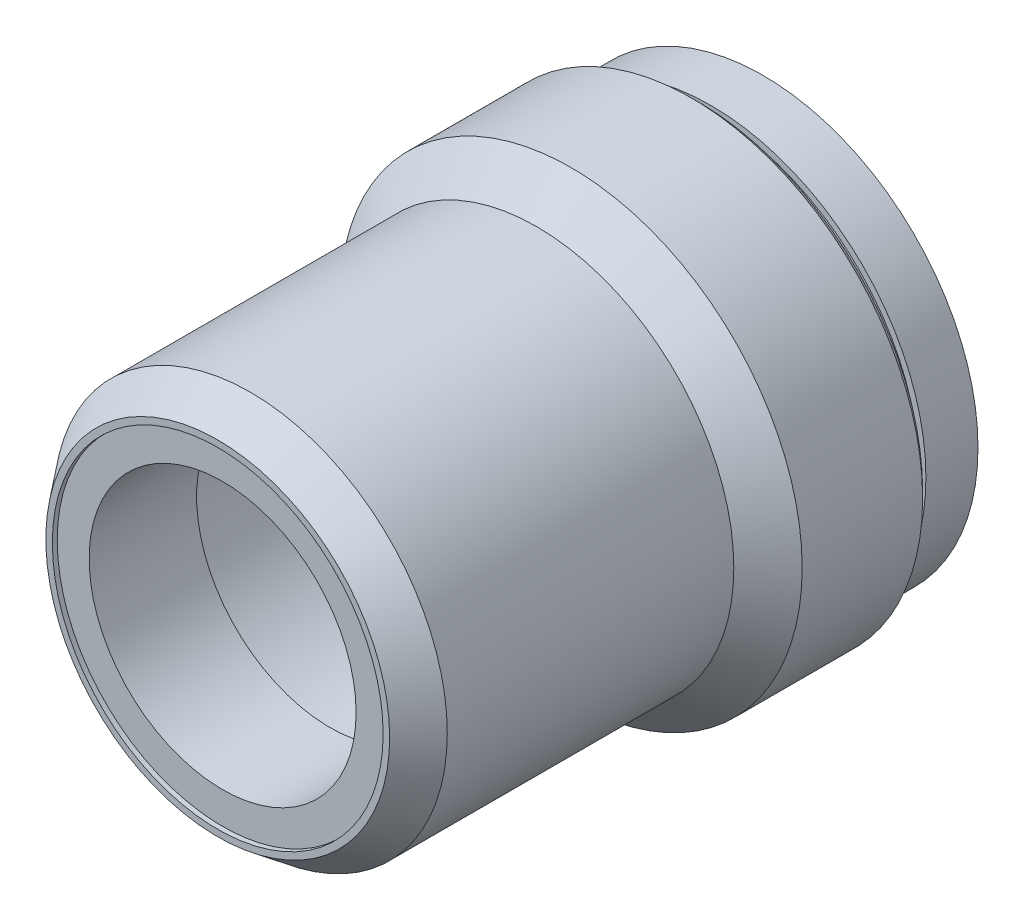
ISO-10303-21;
HEADER;
FILE_DESCRIPTION(('STEP AP214'),'2;1');
FILE_NAME('part.step','',(''),(''),'','','');
FILE_SCHEMA(('AUTOMOTIVE_DESIGN { 1 0 10303 214 1 1 1 1 }'));
ENDSEC;
DATA;
#1=APPLICATION_CONTEXT('core data for automotive mechanical design processes');
#2=APPLICATION_PROTOCOL_DEFINITION('international standard','automotive_design',2000,#1);
#3=PRODUCT_CONTEXT('',#1,'mechanical');
#4=PRODUCT('Part','Part','',(#3));
#5=PRODUCT_RELATED_PRODUCT_CATEGORY('part','',(#4));
#6=PRODUCT_DEFINITION_FORMATION('','',#4);
#7=PRODUCT_DEFINITION_CONTEXT('part definition',#1,'design');
#8=PRODUCT_DEFINITION('design','',#6,#7);
#9=PRODUCT_DEFINITION_SHAPE('','',#8);
#10=(LENGTH_UNIT() NAMED_UNIT(*) SI_UNIT(.MILLI.,.METRE.));
#11=(NAMED_UNIT(*) PLANE_ANGLE_UNIT() SI_UNIT($,.RADIAN.));
#12=(NAMED_UNIT(*) SI_UNIT($,.STERADIAN.) SOLID_ANGLE_UNIT());
#13=UNCERTAINTY_MEASURE_WITH_UNIT(LENGTH_MEASURE(1.E-05),#10,'distance_accuracy_value','');
#14=(GEOMETRIC_REPRESENTATION_CONTEXT(3) GLOBAL_UNCERTAINTY_ASSIGNED_CONTEXT((#13)) GLOBAL_UNIT_ASSIGNED_CONTEXT((#10,
#11,#12)) REPRESENTATION_CONTEXT('',''));
#15=CARTESIAN_POINT('',(0.,0.,0.));
#16=DIRECTION('',(0.,0.,1.));
#17=DIRECTION('',(1.,0.,0.));
#18=AXIS2_PLACEMENT_3D('',#15,#16,#17);
#19=CARTESIAN_POINT('',(0.,0.,35.9278884160858));
#20=DIRECTION('',(0.,0.,1.));
#21=DIRECTION('',(1.,0.,0.));
#22=AXIS2_PLACEMENT_3D('',#19,#20,#21);
#23=CYLINDRICAL_SURFACE('',#22,33.);
#24=CARTESIAN_POINT('',(0.,0.,-75.75));
#25=DIRECTION('',(0.,0.,-1.));
#26=DIRECTION('',(0.,-1.,0.));
#27=AXIS2_PLACEMENT_3D('',#24,#25,#26);
#28=CIRCLE('',#27,33.);
#29=CARTESIAN_POINT('',(0.,-33.,-75.75));
#30=VERTEX_POINT('',#29);
#31=EDGE_CURVE('E10',#30,#30,#28,.T.);
#32=ORIENTED_EDGE('',*,*,#31,.T.);
#33=EDGE_LOOP('',(#32));
#34=FACE_BOUND('',#33,.T.);
#35=CARTESIAN_POINT('',(0.,0.,-83.75));
#36=DIRECTION('',(0.,0.,1.));
#37=DIRECTION('',(1.,0.,0.));
#38=AXIS2_PLACEMENT_3D('',#35,#36,#37);
#39=CIRCLE('',#38,33.);
#40=CARTESIAN_POINT('',(33.,0.,-83.75));
#41=VERTEX_POINT('',#40);
#42=EDGE_CURVE('E22',#41,#41,#39,.T.);
#43=ORIENTED_EDGE('',*,*,#42,.T.);
#44=EDGE_LOOP('',(#43));
#45=FACE_BOUND('',#44,.T.);
#46=ADVANCED_FACE('F14',(#34,#45),#23,.T.);
#47=CARTESIAN_POINT('',(0.,0.,-73.75));
#48=DIRECTION('',(0.,0.,1.));
#49=DIRECTION('',(1.,0.,0.));
#50=AXIS2_PLACEMENT_3D('',#47,#48,#49);
#51=PLANE('',#50);
#52=CARTESIAN_POINT('',(0.,0.,-73.75));
#53=DIRECTION('',(0.,0.,-1.));
#54=DIRECTION('',(1.,0.,0.));
#55=AXIS2_PLACEMENT_3D('',#52,#53,#54);
#56=CIRCLE('',#55,34.5);
#57=CARTESIAN_POINT('',(34.5,0.,-73.75));
#58=VERTEX_POINT('',#57);
#59=EDGE_CURVE('E27',#58,#58,#56,.T.);
#60=ORIENTED_EDGE('',*,*,#59,.T.);
#61=EDGE_LOOP('',(#60));
#62=FACE_BOUND('',#61,.T.);
#63=CARTESIAN_POINT('',(0.,0.,-73.75));
#64=DIRECTION('',(0.,0.,-1.));
#65=DIRECTION('',(0.,-1.,0.));
#66=AXIS2_PLACEMENT_3D('',#63,#64,#65);
#67=CIRCLE('',#66,32.);
#68=CARTESIAN_POINT('',(0.,-32.,-73.75));
#69=VERTEX_POINT('',#68);
#70=EDGE_CURVE('E33',#69,#69,#67,.T.);
#71=ORIENTED_EDGE('',*,*,#70,.F.);
#72=EDGE_LOOP('',(#71));
#73=FACE_BOUND('',#72,.T.);
#74=ADVANCED_FACE('F85',(#62,#73),#51,.F.);
#75=CARTESIAN_POINT('',(0.,0.,35.9278884160858));
#76=DIRECTION('',(0.,0.,1.));
#77=DIRECTION('',(1.,0.,0.));
#78=AXIS2_PLACEMENT_3D('',#75,#76,#77);
#79=CYLINDRICAL_SURFACE('',#78,35.5);
#80=CARTESIAN_POINT('',(0.,0.,-72.75));
#81=DIRECTION('',(0.,0.,1.));
#82=DIRECTION('',(1.,0.,0.));
#83=AXIS2_PLACEMENT_3D('',#80,#81,#82);
#84=CIRCLE('',#83,35.5);
#85=CARTESIAN_POINT('',(35.5,0.,-72.75));
#86=VERTEX_POINT('',#85);
#87=EDGE_CURVE('E32',#86,#86,#84,.T.);
#88=ORIENTED_EDGE('',*,*,#87,.T.);
#89=EDGE_LOOP('',(#88));
#90=FACE_BOUND('',#89,.T.);
#91=CARTESIAN_POINT('',(0.,0.,-54.25));
#92=DIRECTION('',(0.,0.,1.));
#93=DIRECTION('',(1.,0.,0.));
#94=AXIS2_PLACEMENT_3D('',#91,#92,#93);
#95=CIRCLE('',#94,35.5);
#96=CARTESIAN_POINT('',(35.5,0.,-54.25));
#97=VERTEX_POINT('',#96);
#98=EDGE_CURVE('E38',#97,#97,#95,.T.);
#99=ORIENTED_EDGE('',*,*,#98,.F.);
#100=EDGE_LOOP('',(#99));
#101=FACE_BOUND('',#100,.T.);
#102=ADVANCED_FACE('F87',(#90,#101),#79,.T.);
#103=CARTESIAN_POINT('',(0.,0.,-49.));
#104=DIRECTION('',(0.,0.,-1.));
#105=DIRECTION('',(0.,-1.,0.));
#106=AXIS2_PLACEMENT_3D('',#103,#104,#105);
#107=CONICAL_SURFACE('',#106,30.25,0.785398163397454);
#108=ORIENTED_EDGE('',*,*,#98,.T.);
#109=EDGE_LOOP('',(#108));
#110=FACE_BOUND('',#109,.T.);
#111=CARTESIAN_POINT('',(0.,0.,-49.));
#112=DIRECTION('',(0.,0.,1.));
#113=DIRECTION('',(1.,0.,0.));
#114=AXIS2_PLACEMENT_3D('',#111,#112,#113);
#115=CIRCLE('',#114,30.25);
#116=CARTESIAN_POINT('',(30.25,0.,-49.));
#117=VERTEX_POINT('',#116);
#118=EDGE_CURVE('E41',#117,#117,#115,.T.);
#119=ORIENTED_EDGE('',*,*,#118,.F.);
#120=EDGE_LOOP('',(#119));
#121=FACE_BOUND('',#120,.T.);
#122=ADVANCED_FACE('F95',(#110,#121),#107,.T.);
#123=CARTESIAN_POINT('',(0.,0.,35.9278884160858));
#124=DIRECTION('',(0.,0.,1.));
#125=DIRECTION('',(1.,0.,0.));
#126=AXIS2_PLACEMENT_3D('',#123,#124,#125);
#127=CYLINDRICAL_SURFACE('',#126,30.25);
#128=ORIENTED_EDGE('',*,*,#118,.T.);
#129=EDGE_LOOP('',(#128));
#130=FACE_BOUND('',#129,.T.);
#131=CARTESIAN_POINT('',(0.,0.,-4.99999999999999));
#132=DIRECTION('',(0.,0.,1.));
#133=DIRECTION('',(1.,0.,0.));
#134=AXIS2_PLACEMENT_3D('',#131,#132,#133);
#135=CIRCLE('',#134,30.25);
#136=CARTESIAN_POINT('',(30.25,0.,-4.99999999999999));
#137=VERTEX_POINT('',#136);
#138=EDGE_CURVE('E44',#137,#137,#135,.T.);
#139=ORIENTED_EDGE('',*,*,#138,.F.);
#140=EDGE_LOOP('',(#139));
#141=FACE_BOUND('',#140,.T.);
#142=ADVANCED_FACE('F124',(#130,#141),#127,.T.);
#143=CARTESIAN_POINT('',(0.,0.,0.));
#144=DIRECTION('',(0.,0.,-1.));
#145=DIRECTION('',(0.,-1.,0.));
#146=AXIS2_PLACEMENT_3D('',#143,#144,#145);
#147=CONICAL_SURFACE('',#146,26.4,0.656178717991392);
#148=ORIENTED_EDGE('',*,*,#138,.T.);
#149=EDGE_LOOP('',(#148));
#150=FACE_BOUND('',#149,.T.);
#151=CARTESIAN_POINT('',(0.,0.,0.));
#152=DIRECTION('',(0.,0.,1.));
#153=DIRECTION('',(1.,0.,0.));
#154=AXIS2_PLACEMENT_3D('',#151,#152,#153);
#155=CIRCLE('',#154,26.4);
#156=CARTESIAN_POINT('',(26.4,0.,0.));
#157=VERTEX_POINT('',#156);
#158=EDGE_CURVE('E47',#157,#157,#155,.T.);
#159=ORIENTED_EDGE('',*,*,#158,.F.);
#160=EDGE_LOOP('',(#159));
#161=FACE_BOUND('',#160,.T.);
#162=ADVANCED_FACE('F104',(#150,#161),#147,.T.);
#163=CARTESIAN_POINT('',(0.,0.,0.));
#164=DIRECTION('',(0.,0.,1.));
#165=DIRECTION('',(1.,0.,0.));
#166=AXIS2_PLACEMENT_3D('',#163,#164,#165);
#167=PLANE('',#166);
#168=ORIENTED_EDGE('',*,*,#158,.T.);
#169=EDGE_LOOP('',(#168));
#170=FACE_BOUND('',#169,.T.);
#171=CARTESIAN_POINT('',(0.,0.,0.));
#172=DIRECTION('',(0.,0.,1.));
#173=DIRECTION('',(1.,0.,0.));
#174=AXIS2_PLACEMENT_3D('',#171,#172,#173);
#175=CIRCLE('',#174,25.4);
#176=CARTESIAN_POINT('',(25.4,0.,0.));
#177=VERTEX_POINT('',#176);
#178=EDGE_CURVE('E50',#177,#177,#175,.T.);
#179=ORIENTED_EDGE('',*,*,#178,.F.);
#180=EDGE_LOOP('',(#179));
#181=FACE_BOUND('',#180,.T.);
#182=ADVANCED_FACE('F100',(#170,#181),#167,.T.);
#183=CARTESIAN_POINT('',(0.,0.,35.9278884160858));
#184=DIRECTION('',(0.,0.,1.));
#185=DIRECTION('',(1.,0.,0.));
#186=AXIS2_PLACEMENT_3D('',#183,#184,#185);
#187=CYLINDRICAL_SURFACE('',#186,25.4);
#188=CARTESIAN_POINT('',(0.,0.,-0.749999999999994));
#189=DIRECTION('',(0.,0.,1.));
#190=DIRECTION('',(1.,0.,0.));
#191=AXIS2_PLACEMENT_3D('',#188,#189,#190);
#192=CIRCLE('',#191,25.4);
#193=CARTESIAN_POINT('',(25.4,0.,-0.749999999999994));
#194=VERTEX_POINT('',#193);
#195=EDGE_CURVE('E53',#194,#194,#192,.T.);
#196=ORIENTED_EDGE('',*,*,#195,.F.);
#197=EDGE_LOOP('',(#196));
#198=FACE_BOUND('',#197,.T.);
#199=ORIENTED_EDGE('',*,*,#178,.T.);
#200=EDGE_LOOP('',(#199));
#201=FACE_BOUND('',#200,.T.);
#202=ADVANCED_FACE('F103',(#198,#201),#187,.F.);
#203=CARTESIAN_POINT('',(0.,0.,-0.749999999999997));
#204=DIRECTION('',(0.,0.,-1.));
#205=DIRECTION('',(-1.,0.,0.));
#206=AXIS2_PLACEMENT_3D('',#203,#204,#205);
#207=PLANE('',#206);
#208=ORIENTED_EDGE('',*,*,#195,.T.);
#209=EDGE_LOOP('',(#208));
#210=FACE_BOUND('',#209,.T.);
#211=CARTESIAN_POINT('',(0.,0.,-0.749999999999994));
#212=DIRECTION('',(0.,0.,1.));
#213=DIRECTION('',(1.,0.,0.));
#214=AXIS2_PLACEMENT_3D('',#211,#212,#213);
#215=CIRCLE('',#214,20.5);
#216=CARTESIAN_POINT('',(20.5,0.,-0.749999999999994));
#217=VERTEX_POINT('',#216);
#218=EDGE_CURVE('E56',#217,#217,#215,.T.);
#219=ORIENTED_EDGE('',*,*,#218,.F.);
#220=EDGE_LOOP('',(#219));
#221=FACE_BOUND('',#220,.T.);
#222=ADVANCED_FACE('F106',(#210,#221),#207,.F.);
#223=CARTESIAN_POINT('',(0.,0.,35.9278884160858));
#224=DIRECTION('',(0.,0.,1.));
#225=DIRECTION('',(1.,0.,0.));
#226=AXIS2_PLACEMENT_3D('',#223,#224,#225);
#227=CYLINDRICAL_SURFACE('',#226,20.5);
#228=CARTESIAN_POINT('',(0.,0.,-17.25));
#229=DIRECTION('',(0.,0.,1.));
#230=DIRECTION('',(1.,0.,0.));
#231=AXIS2_PLACEMENT_3D('',#228,#229,#230);
#232=CIRCLE('',#231,20.5);
#233=CARTESIAN_POINT('',(20.5,0.,-17.25));
#234=VERTEX_POINT('',#233);
#235=EDGE_CURVE('E59',#234,#234,#232,.T.);
#236=ORIENTED_EDGE('',*,*,#235,.F.);
#237=EDGE_LOOP('',(#236));
#238=FACE_BOUND('',#237,.T.);
#239=ORIENTED_EDGE('',*,*,#218,.T.);
#240=EDGE_LOOP('',(#239));
#241=FACE_BOUND('',#240,.T.);
#242=ADVANCED_FACE('F109',(#238,#241),#227,.F.);
#243=CARTESIAN_POINT('',(0.,0.,-17.25));
#244=DIRECTION('',(0.,0.,1.));
#245=DIRECTION('',(1.,0.,0.));
#246=AXIS2_PLACEMENT_3D('',#243,#244,#245);
#247=PLANE('',#246);
#248=CARTESIAN_POINT('',(0.,0.,-17.25));
#249=DIRECTION('',(0.,0.,1.));
#250=DIRECTION('',(1.,0.,0.));
#251=AXIS2_PLACEMENT_3D('',#248,#249,#250);
#252=CIRCLE('',#251,25.5);
#253=CARTESIAN_POINT('',(25.5,0.,-17.25));
#254=VERTEX_POINT('',#253);
#255=EDGE_CURVE('E62',#254,#254,#252,.T.);
#256=ORIENTED_EDGE('',*,*,#255,.F.);
#257=EDGE_LOOP('',(#256));
#258=FACE_BOUND('',#257,.T.);
#259=ORIENTED_EDGE('',*,*,#235,.T.);
#260=EDGE_LOOP('',(#259));
#261=FACE_BOUND('',#260,.T.);
#262=ADVANCED_FACE('F111',(#258,#261),#247,.F.);
#263=CARTESIAN_POINT('',(0.,0.,35.9278884160858));
#264=DIRECTION('',(0.,0.,1.));
#265=DIRECTION('',(1.,0.,0.));
#266=AXIS2_PLACEMENT_3D('',#263,#264,#265);
#267=CYLINDRICAL_SURFACE('',#266,25.5);
#268=CARTESIAN_POINT('',(0.,0.,-51.3210678118655));
#269=DIRECTION('',(0.,0.,1.));
#270=DIRECTION('',(1.,0.,0.));
#271=AXIS2_PLACEMENT_3D('',#268,#269,#270);
#272=CIRCLE('',#271,25.5);
#273=CARTESIAN_POINT('',(25.5,0.,-51.3210678118655));
#274=VERTEX_POINT('',#273);
#275=EDGE_CURVE('E65',#274,#274,#272,.T.);
#276=ORIENTED_EDGE('',*,*,#275,.F.);
#277=EDGE_LOOP('',(#276));
#278=FACE_BOUND('',#277,.T.);
#279=ORIENTED_EDGE('',*,*,#255,.T.);
#280=EDGE_LOOP('',(#279));
#281=FACE_BOUND('',#280,.T.);
#282=ADVANCED_FACE('F114',(#278,#281),#267,.F.);
#283=CARTESIAN_POINT('',(0.,0.,-51.3210678118655));
#284=DIRECTION('',(0.,0.,-1.));
#285=DIRECTION('',(0.,-1.,0.));
#286=AXIS2_PLACEMENT_3D('',#283,#284,#285);
#287=CONICAL_SURFACE('',#286,25.5,0.785398163397454);
#288=CARTESIAN_POINT('',(0.,0.,-56.3210678118655));
#289=DIRECTION('',(0.,0.,1.));
#290=DIRECTION('',(1.,0.,0.));
#291=AXIS2_PLACEMENT_3D('',#288,#289,#290);
#292=CIRCLE('',#291,30.5);
#293=CARTESIAN_POINT('',(30.5,0.,-56.3210678118655));
#294=VERTEX_POINT('',#293);
#295=EDGE_CURVE('E68',#294,#294,#292,.T.);
#296=ORIENTED_EDGE('',*,*,#295,.F.);
#297=EDGE_LOOP('',(#296));
#298=FACE_BOUND('',#297,.T.);
#299=ORIENTED_EDGE('',*,*,#275,.T.);
#300=EDGE_LOOP('',(#299));
#301=FACE_BOUND('',#300,.T.);
#302=ADVANCED_FACE('F139',(#298,#301),#287,.F.);
#303=CARTESIAN_POINT('',(0.,0.,35.9278884160858));
#304=DIRECTION('',(0.,0.,1.));
#305=DIRECTION('',(1.,0.,0.));
#306=AXIS2_PLACEMENT_3D('',#303,#304,#305);
#307=CYLINDRICAL_SURFACE('',#306,30.5);
#308=CARTESIAN_POINT('',(0.,0.,-83.75));
#309=DIRECTION('',(0.,0.,1.));
#310=DIRECTION('',(1.,0.,0.));
#311=AXIS2_PLACEMENT_3D('',#308,#309,#310);
#312=CIRCLE('',#311,30.5);
#313=CARTESIAN_POINT('',(30.5,0.,-83.75));
#314=VERTEX_POINT('',#313);
#315=EDGE_CURVE('E70',#314,#314,#312,.T.);
#316=ORIENTED_EDGE('',*,*,#315,.F.);
#317=EDGE_LOOP('',(#316));
#318=FACE_BOUND('',#317,.T.);
#319=ORIENTED_EDGE('',*,*,#295,.T.);
#320=EDGE_LOOP('',(#319));
#321=FACE_BOUND('',#320,.T.);
#322=ADVANCED_FACE('F119',(#318,#321),#307,.F.);
#323=CARTESIAN_POINT('',(-2.32452945780892E-13,0.,-83.75));
#324=DIRECTION('',(0.,0.,1.));
#325=DIRECTION('',(1.,0.,0.));
#326=AXIS2_PLACEMENT_3D('',#323,#324,#325);
#327=PLANE('',#326);
#328=ORIENTED_EDGE('',*,*,#42,.F.);
#329=EDGE_LOOP('',(#328));
#330=FACE_BOUND('',#329,.T.);
#331=ORIENTED_EDGE('',*,*,#315,.T.);
#332=EDGE_LOOP('',(#331));
#333=FACE_BOUND('',#332,.T.);
#334=ADVANCED_FACE('F116',(#330,#333),#327,.F.);
#335=CARTESIAN_POINT('',(0.,0.,-72.75));
#336=DIRECTION('',(0.,0.,1.));
#337=DIRECTION('',(1.,0.,0.));
#338=AXIS2_PLACEMENT_3D('',#335,#336,#337);
#339=CONICAL_SURFACE('',#338,35.5,0.785398163397448);
#340=ORIENTED_EDGE('',*,*,#59,.F.);
#341=EDGE_LOOP('',(#340));
#342=FACE_BOUND('',#341,.T.);
#343=ORIENTED_EDGE('',*,*,#87,.F.);
#344=EDGE_LOOP('',(#343));
#345=FACE_BOUND('',#344,.T.);
#346=ADVANCED_FACE('F16',(#342,#345),#339,.T.);
#347=CARTESIAN_POINT('',(0.,0.,-75.75));
#348=DIRECTION('',(0.,0.,-1.));
#349=DIRECTION('',(-1.,0.,0.));
#350=AXIS2_PLACEMENT_3D('',#347,#348,#349);
#351=PLANE('',#350);
#352=ORIENTED_EDGE('',*,*,#31,.F.);
#353=EDGE_LOOP('',(#352));
#354=FACE_BOUND('',#353,.T.);
#355=CARTESIAN_POINT('',(0.,0.,-75.75));
#356=DIRECTION('',(0.,0.,-1.));
#357=DIRECTION('',(0.,-1.,0.));
#358=AXIS2_PLACEMENT_3D('',#355,#356,#357);
#359=CIRCLE('',#358,32.);
#360=CARTESIAN_POINT('',(0.,-32.,-75.75));
#361=VERTEX_POINT('',#360);
#362=EDGE_CURVE('E18',#361,#361,#359,.T.);
#363=ORIENTED_EDGE('',*,*,#362,.T.);
#364=EDGE_LOOP('',(#363));
#365=FACE_BOUND('',#364,.T.);
#366=ADVANCED_FACE('F77',(#354,#365),#351,.F.);
#367=CARTESIAN_POINT('',(0.,0.,-75.75));
#368=DIRECTION('',(0.,0.,1.));
#369=DIRECTION('',(1.,0.,0.));
#370=AXIS2_PLACEMENT_3D('',#367,#368,#369);
#371=CYLINDRICAL_SURFACE('',#370,32.);
#372=ORIENTED_EDGE('',*,*,#362,.F.);
#373=EDGE_LOOP('',(#372));
#374=FACE_BOUND('',#373,.T.);
#375=ORIENTED_EDGE('',*,*,#70,.T.);
#376=EDGE_LOOP('',(#375));
#377=FACE_BOUND('',#376,.T.);
#378=ADVANCED_FACE('F79',(#374,#377),#371,.T.);
#379=CLOSED_SHELL('',(#46,#74,#102,#122,#142,#162,#182,#202,#222,#242,#262,#282,#302,#322,#334,
#346,#366,#378));
#380=MANIFOLD_SOLID_BREP('B1',#379);
#381=ADVANCED_BREP_SHAPE_REPRESENTATION('',(#18,#380),#14);
#382=SHAPE_DEFINITION_REPRESENTATION(#9,#381);
ENDSEC;
END-ISO-10303-21;
